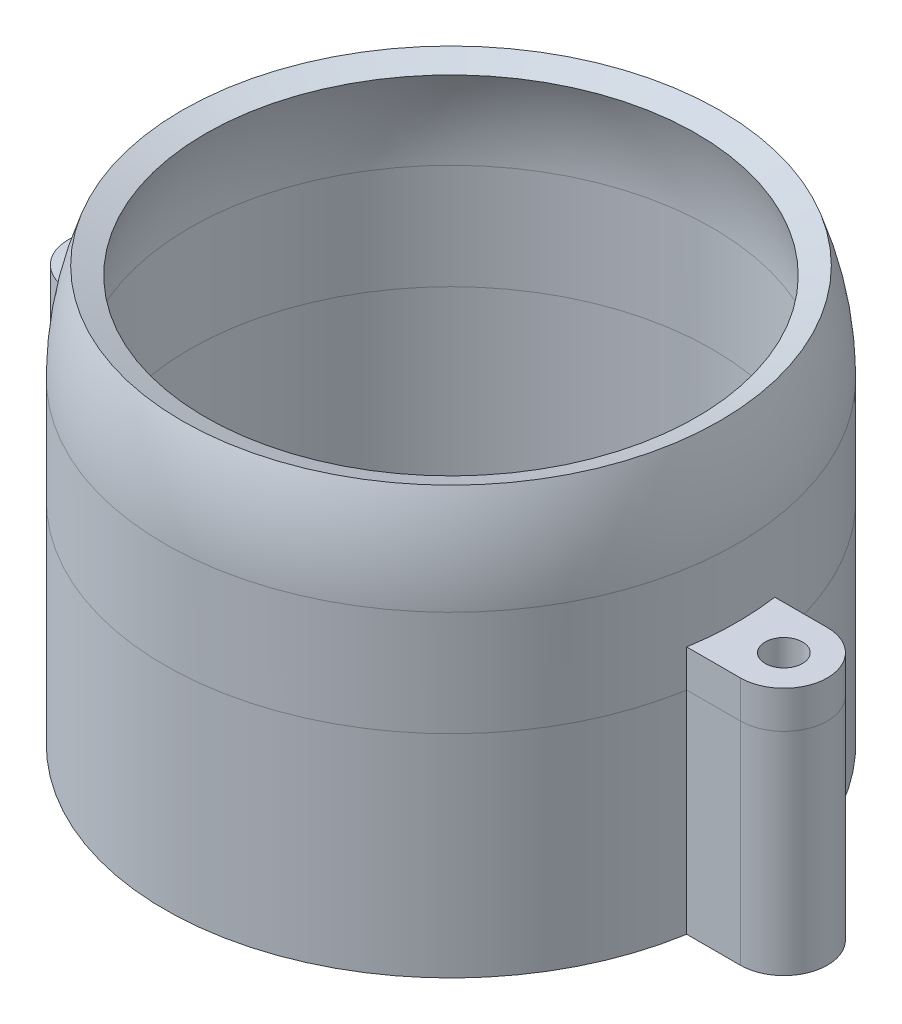
ISO-10303-21;
HEADER;
FILE_DESCRIPTION(('STEP AP214'),'2;1');
FILE_NAME('part.step','',(''),(''),'','','');
FILE_SCHEMA(('AUTOMOTIVE_DESIGN { 1 0 10303 214 1 1 1 1 }'));
ENDSEC;
DATA;
#1=APPLICATION_CONTEXT('core data for automotive mechanical design processes');
#2=APPLICATION_PROTOCOL_DEFINITION('international standard','automotive_design',2000,#1);
#3=PRODUCT_CONTEXT('',#1,'mechanical');
#4=PRODUCT('Part','Part','',(#3));
#5=PRODUCT_RELATED_PRODUCT_CATEGORY('part','',(#4));
#6=PRODUCT_DEFINITION_FORMATION('','',#4);
#7=PRODUCT_DEFINITION_CONTEXT('part definition',#1,'design');
#8=PRODUCT_DEFINITION('design','',#6,#7);
#9=PRODUCT_DEFINITION_SHAPE('','',#8);
#10=(LENGTH_UNIT() NAMED_UNIT(*) SI_UNIT(.MILLI.,.METRE.));
#11=(NAMED_UNIT(*) PLANE_ANGLE_UNIT() SI_UNIT($,.RADIAN.));
#12=(NAMED_UNIT(*) SI_UNIT($,.STERADIAN.) SOLID_ANGLE_UNIT());
#13=UNCERTAINTY_MEASURE_WITH_UNIT(LENGTH_MEASURE(1.E-05),#10,'distance_accuracy_value','');
#14=(GEOMETRIC_REPRESENTATION_CONTEXT(3) GLOBAL_UNCERTAINTY_ASSIGNED_CONTEXT((#13)) GLOBAL_UNIT_ASSIGNED_CONTEXT((#10,
#11,#12)) REPRESENTATION_CONTEXT('',''));
#15=CARTESIAN_POINT('',(0.,0.,0.));
#16=DIRECTION('',(0.,0.,1.));
#17=DIRECTION('',(1.,0.,0.));
#18=AXIS2_PLACEMENT_3D('',#15,#16,#17);
#19=CARTESIAN_POINT('',(0.,17.,0.));
#20=DIRECTION('',(0.,-1.,0.));
#21=DIRECTION('',(1.,0.,0.));
#22=AXIS2_PLACEMENT_3D('',#19,#20,#21);
#23=PLANE('',#22);
#24=CARTESIAN_POINT('',(-27.,17.,0.250000000000004));
#25=DIRECTION('',(0.,-1.,0.));
#26=DIRECTION('',(1.,0.,0.));
#27=AXIS2_PLACEMENT_3D('',#24,#25,#26);
#28=CIRCLE('',#27,1.5);
#29=CARTESIAN_POINT('',(-25.5,17.,0.250000000000004));
#30=VERTEX_POINT('',#29);
#31=EDGE_CURVE('E191',#30,#30,#28,.F.);
#32=ORIENTED_EDGE('',*,*,#31,.T.);
#33=EDGE_LOOP('',(#32));
#34=FACE_BOUND('',#33,.T.);
#35=DIRECTION('',(-1.,0.,0.));
#36=VECTOR('',#35,1.);
#37=CARTESIAN_POINT('',(-27.,17.,-3.25));
#38=LINE('',#37,#36);
#39=CARTESIAN_POINT('',(-22.7692226481274,17.,-3.24999999999999));
#40=VERTEX_POINT('',#39);
#41=CARTESIAN_POINT('',(-27.,17.,-3.25));
#42=VERTEX_POINT('',#41);
#43=EDGE_CURVE('E131',#40,#42,#38,.T.);
#44=ORIENTED_EDGE('',*,*,#43,.F.);
#45=CARTESIAN_POINT('',(0.,17.,0.));
#46=DIRECTION('',(0.,-1.,0.));
#47=DIRECTION('',(1.,0.,0.));
#48=AXIS2_PLACEMENT_3D('',#45,#46,#47);
#49=CIRCLE('',#48,23.);
#50=CARTESIAN_POINT('',(22.7692226481274,17.,-3.25));
#51=VERTEX_POINT('',#50);
#52=EDGE_CURVE('E189',#40,#51,#49,.T.);
#53=ORIENTED_EDGE('',*,*,#52,.T.);
#54=DIRECTION('',(-1.,0.,0.));
#55=VECTOR('',#54,1.);
#56=CARTESIAN_POINT('',(27.,17.,-3.25));
#57=LINE('',#56,#55);
#58=CARTESIAN_POINT('',(27.,17.,-3.25));
#59=VERTEX_POINT('',#58);
#60=EDGE_CURVE('E182',#59,#51,#57,.T.);
#61=ORIENTED_EDGE('',*,*,#60,.F.);
#62=CARTESIAN_POINT('',(27.,17.,0.250000000000004));
#63=DIRECTION('',(0.,-1.,0.));
#64=DIRECTION('',(1.,0.,0.));
#65=AXIS2_PLACEMENT_3D('',#62,#63,#64);
#66=CIRCLE('',#65,3.5);
#67=CARTESIAN_POINT('',(27.,17.,3.75));
#68=VERTEX_POINT('',#67);
#69=EDGE_CURVE('E184',#68,#59,#66,.F.);
#70=ORIENTED_EDGE('',*,*,#69,.F.);
#71=DIRECTION('',(1.,0.,0.));
#72=VECTOR('',#71,1.);
#73=CARTESIAN_POINT('',(27.,17.,3.75));
#74=LINE('',#73,#72);
#75=CARTESIAN_POINT('',(22.6922343545099,17.,3.75));
#76=VERTEX_POINT('',#75);
#77=EDGE_CURVE('E179',#76,#68,#74,.T.);
#78=ORIENTED_EDGE('',*,*,#77,.F.);
#79=CARTESIAN_POINT('',(-22.6922343545099,17.,3.75));
#80=VERTEX_POINT('',#79);
#81=EDGE_CURVE('E126',#76,#80,#49,.T.);
#82=ORIENTED_EDGE('',*,*,#81,.T.);
#83=DIRECTION('',(1.,0.,0.));
#84=VECTOR('',#83,1.);
#85=CARTESIAN_POINT('',(-27.,17.,3.75));
#86=LINE('',#85,#84);
#87=CARTESIAN_POINT('',(-27.,17.,3.75));
#88=VERTEX_POINT('',#87);
#89=EDGE_CURVE('E120',#88,#80,#86,.T.);
#90=ORIENTED_EDGE('',*,*,#89,.F.);
#91=CARTESIAN_POINT('',(-27.,17.,0.250000000000004));
#92=DIRECTION('',(0.,-1.,0.));
#93=DIRECTION('',(1.,0.,0.));
#94=AXIS2_PLACEMENT_3D('',#91,#92,#93);
#95=CIRCLE('',#94,3.5);
#96=EDGE_CURVE('E123',#42,#88,#95,.F.);
#97=ORIENTED_EDGE('',*,*,#96,.F.);
#98=EDGE_LOOP('',(#44,#53,#61,#70,#78,#82,#90,#97));
#99=FACE_BOUND('',#98,.T.);
#100=CARTESIAN_POINT('',(27.,17.,0.250000000000004));
#101=DIRECTION('',(0.,-1.,0.));
#102=DIRECTION('',(1.,0.,0.));
#103=AXIS2_PLACEMENT_3D('',#100,#101,#102);
#104=CIRCLE('',#103,1.5);
#105=CARTESIAN_POINT('',(28.5,17.,0.250000000000004));
#106=VERTEX_POINT('',#105);
#107=EDGE_CURVE('E153',#106,#106,#104,.F.);
#108=ORIENTED_EDGE('',*,*,#107,.T.);
#109=EDGE_LOOP('',(#108));
#110=FACE_BOUND('',#109,.T.);
#111=CARTESIAN_POINT('',(0.,17.,0.));
#112=DIRECTION('',(0.,-1.,0.));
#113=DIRECTION('',(1.,0.,0.));
#114=AXIS2_PLACEMENT_3D('',#111,#112,#113);
#115=CIRCLE('',#114,21.);
#116=CARTESIAN_POINT('',(21.,17.,0.));
#117=VERTEX_POINT('',#116);
#118=EDGE_CURVE('E139',#117,#117,#115,.T.);
#119=ORIENTED_EDGE('',*,*,#118,.F.);
#120=EDGE_LOOP('',(#119));
#121=FACE_BOUND('',#120,.T.);
#122=ADVANCED_FACE('F51',(#34,#99,#110,#121),#23,.T.);
#123=CARTESIAN_POINT('',(0.,25.4499443206436,0.));
#124=DIRECTION('',(0.,1.,0.));
#125=DIRECTION('',(-1.,0.,0.));
#126=AXIS2_PLACEMENT_3D('',#123,#124,#125);
#127=CYLINDRICAL_SURFACE('',#126,23.);
#128=CARTESIAN_POINT('',(0.,25.4499443206436,0.));
#129=DIRECTION('',(0.,1.,0.));
#130=DIRECTION('',(-1.,0.,0.));
#131=AXIS2_PLACEMENT_3D('',#128,#129,#130);
#132=CIRCLE('',#131,23.);
#133=CARTESIAN_POINT('',(-23.,25.4499443206436,0.));
#134=VERTEX_POINT('',#133);
#135=EDGE_CURVE('E181',#134,#134,#132,.T.);
#136=ORIENTED_EDGE('',*,*,#135,.F.);
#137=EDGE_LOOP('',(#136));
#138=FACE_BOUND('',#137,.T.);
#139=ORIENTED_EDGE('',*,*,#81,.F.);
#140=DIRECTION('',(0.,-1.,0.));
#141=VECTOR('',#140,1.);
#142=CARTESIAN_POINT('',(22.6922343545099,20.,3.75));
#143=LINE('',#142,#141);
#144=CARTESIAN_POINT('',(22.6922343545099,20.,3.75));
#145=VERTEX_POINT('',#144);
#146=EDGE_CURVE('E163',#145,#76,#143,.T.);
#147=ORIENTED_EDGE('',*,*,#146,.F.);
#148=CARTESIAN_POINT('',(0.,20.,0.));
#149=DIRECTION('',(0.,1.,0.));
#150=DIRECTION('',(0.,0.,-1.));
#151=AXIS2_PLACEMENT_3D('',#148,#149,#150);
#152=CIRCLE('',#151,23.);
#153=CARTESIAN_POINT('',(22.7692226481274,20.,-3.25));
#154=VERTEX_POINT('',#153);
#155=EDGE_CURVE('E167',#145,#154,#152,.T.);
#156=ORIENTED_EDGE('',*,*,#155,.T.);
#157=DIRECTION('',(0.,-1.,0.));
#158=VECTOR('',#157,1.);
#159=CARTESIAN_POINT('',(22.7692226481274,20.,-3.25));
#160=LINE('',#159,#158);
#161=EDGE_CURVE('E160',#154,#51,#160,.T.);
#162=ORIENTED_EDGE('',*,*,#161,.T.);
#163=ORIENTED_EDGE('',*,*,#52,.F.);
#164=DIRECTION('',(0.,-1.,0.));
#165=VECTOR('',#164,1.);
#166=CARTESIAN_POINT('',(-22.7692226481274,20.,-3.24999999999999));
#167=LINE('',#166,#165);
#168=CARTESIAN_POINT('',(-22.7692226481274,20.,-3.24999999999999));
#169=VERTEX_POINT('',#168);
#170=EDGE_CURVE('E147',#169,#40,#167,.T.);
#171=ORIENTED_EDGE('',*,*,#170,.F.);
#172=CARTESIAN_POINT('',(0.,20.,0.));
#173=DIRECTION('',(0.,1.,0.));
#174=DIRECTION('',(0.,0.,1.));
#175=AXIS2_PLACEMENT_3D('',#172,#173,#174);
#176=CIRCLE('',#175,23.);
#177=CARTESIAN_POINT('',(-22.6922343545099,20.,3.75));
#178=VERTEX_POINT('',#177);
#179=EDGE_CURVE('E254',#169,#178,#176,.T.);
#180=ORIENTED_EDGE('',*,*,#179,.T.);
#181=DIRECTION('',(0.,-1.,0.));
#182=VECTOR('',#181,1.);
#183=CARTESIAN_POINT('',(-22.6922343545099,20.,3.75));
#184=LINE('',#183,#182);
#185=EDGE_CURVE('E144',#178,#80,#184,.T.);
#186=ORIENTED_EDGE('',*,*,#185,.T.);
#187=EDGE_LOOP('',(#139,#147,#156,#162,#163,#171,#180,#186));
#188=FACE_BOUND('',#187,.T.);
#189=ADVANCED_FACE('F216',(#138,#188),#127,.T.);
#190=CARTESIAN_POINT('',(0.,25.4499443206436,0.));
#191=DIRECTION('',(0.,1.,0.));
#192=DIRECTION('',(-1.,0.,0.));
#193=AXIS2_PLACEMENT_3D('',#190,#191,#192);
#194=CYLINDRICAL_SURFACE('',#193,21.);
#195=CARTESIAN_POINT('',(0.,25.4499443206436,0.));
#196=DIRECTION('',(0.,1.,0.));
#197=DIRECTION('',(-1.,0.,0.));
#198=AXIS2_PLACEMENT_3D('',#195,#196,#197);
#199=CIRCLE('',#198,21.);
#200=CARTESIAN_POINT('',(-21.,25.4499443206436,0.));
#201=VERTEX_POINT('',#200);
#202=EDGE_CURVE('E261',#201,#201,#199,.T.);
#203=ORIENTED_EDGE('',*,*,#202,.T.);
#204=EDGE_LOOP('',(#203));
#205=FACE_BOUND('',#204,.T.);
#206=ORIENTED_EDGE('',*,*,#118,.T.);
#207=EDGE_LOOP('',(#206));
#208=FACE_BOUND('',#207,.T.);
#209=ADVANCED_FACE('F218',(#205,#208),#194,.F.);
#210=CARTESIAN_POINT('',(-27.,20.,0.250000000000004));
#211=DIRECTION('',(0.,-1.,0.));
#212=DIRECTION('',(0.,0.,-1.));
#213=AXIS2_PLACEMENT_3D('',#210,#211,#212);
#214=CYLINDRICAL_SURFACE('',#213,3.5);
#215=DIRECTION('',(0.,-1.,0.));
#216=VECTOR('',#215,1.);
#217=CARTESIAN_POINT('',(-27.,20.,-3.25));
#218=LINE('',#217,#216);
#219=CARTESIAN_POINT('',(-27.,20.,-3.25));
#220=VERTEX_POINT('',#219);
#221=EDGE_CURVE('E138',#220,#42,#218,.T.);
#222=ORIENTED_EDGE('',*,*,#221,.T.);
#223=ORIENTED_EDGE('',*,*,#96,.T.);
#224=DIRECTION('',(0.,-1.,0.));
#225=VECTOR('',#224,1.);
#226=CARTESIAN_POINT('',(-27.,20.,3.75));
#227=LINE('',#226,#225);
#228=CARTESIAN_POINT('',(-27.,20.,3.75));
#229=VERTEX_POINT('',#228);
#230=EDGE_CURVE('E136',#229,#88,#227,.T.);
#231=ORIENTED_EDGE('',*,*,#230,.F.);
#232=CARTESIAN_POINT('',(-27.,20.,0.250000000000004));
#233=DIRECTION('',(0.,-1.,0.));
#234=DIRECTION('',(0.,0.,-1.));
#235=AXIS2_PLACEMENT_3D('',#232,#233,#234);
#236=CIRCLE('',#235,3.5);
#237=EDGE_CURVE('E251',#229,#220,#236,.T.);
#238=ORIENTED_EDGE('',*,*,#237,.T.);
#239=EDGE_LOOP('',(#222,#223,#231,#238));
#240=FACE_BOUND('',#239,.T.);
#241=ADVANCED_FACE('F134',(#240),#214,.T.);
#242=CARTESIAN_POINT('',(-27.,20.,3.75));
#243=DIRECTION('',(0.,0.,1.));
#244=DIRECTION('',(1.,0.,0.));
#245=AXIS2_PLACEMENT_3D('',#242,#243,#244);
#246=PLANE('',#245);
#247=ORIENTED_EDGE('',*,*,#230,.T.);
#248=ORIENTED_EDGE('',*,*,#89,.T.);
#249=ORIENTED_EDGE('',*,*,#185,.F.);
#250=DIRECTION('',(-1.,0.,0.));
#251=VECTOR('',#250,1.);
#252=CARTESIAN_POINT('',(-27.,20.,3.75));
#253=LINE('',#252,#251);
#254=EDGE_CURVE('E143',#178,#229,#253,.T.);
#255=ORIENTED_EDGE('',*,*,#254,.T.);
#256=EDGE_LOOP('',(#247,#248,#249,#255));
#257=FACE_BOUND('',#256,.T.);
#258=ADVANCED_FACE('F53',(#257),#246,.T.);
#259=CARTESIAN_POINT('',(-27.,20.,-3.25));
#260=DIRECTION('',(0.,0.,-1.));
#261=DIRECTION('',(-1.,0.,0.));
#262=AXIS2_PLACEMENT_3D('',#259,#260,#261);
#263=PLANE('',#262);
#264=ORIENTED_EDGE('',*,*,#170,.T.);
#265=ORIENTED_EDGE('',*,*,#43,.T.);
#266=ORIENTED_EDGE('',*,*,#221,.F.);
#267=DIRECTION('',(1.,0.,0.));
#268=VECTOR('',#267,1.);
#269=CARTESIAN_POINT('',(-27.,20.,-3.25));
#270=LINE('',#269,#268);
#271=EDGE_CURVE('E252',#220,#169,#270,.T.);
#272=ORIENTED_EDGE('',*,*,#271,.T.);
#273=EDGE_LOOP('',(#264,#265,#266,#272));
#274=FACE_BOUND('',#273,.T.);
#275=ADVANCED_FACE('F240',(#274),#263,.T.);
#276=CARTESIAN_POINT('',(-27.,20.,0.250000000000004));
#277=DIRECTION('',(0.,-1.,0.));
#278=DIRECTION('',(0.,0.,-1.));
#279=AXIS2_PLACEMENT_3D('',#276,#277,#278);
#280=CYLINDRICAL_SURFACE('',#279,1.5);
#281=CARTESIAN_POINT('',(-27.,20.,0.250000000000004));
#282=DIRECTION('',(0.,-1.,0.));
#283=DIRECTION('',(0.,0.,-1.));
#284=AXIS2_PLACEMENT_3D('',#281,#282,#283);
#285=CIRCLE('',#284,1.5);
#286=CARTESIAN_POINT('',(-27.,20.,-1.25));
#287=VERTEX_POINT('',#286);
#288=EDGE_CURVE('E161',#287,#287,#285,.T.);
#289=ORIENTED_EDGE('',*,*,#288,.F.);
#290=EDGE_LOOP('',(#289));
#291=FACE_BOUND('',#290,.T.);
#292=ORIENTED_EDGE('',*,*,#31,.F.);
#293=EDGE_LOOP('',(#292));
#294=FACE_BOUND('',#293,.T.);
#295=ADVANCED_FACE('F234',(#291,#294),#280,.F.);
#296=CARTESIAN_POINT('',(27.,20.,0.250000000000004));
#297=DIRECTION('',(0.,-1.,0.));
#298=DIRECTION('',(0.,0.,-1.));
#299=AXIS2_PLACEMENT_3D('',#296,#297,#298);
#300=CYLINDRICAL_SURFACE('',#299,3.5);
#301=DIRECTION('',(0.,-1.,0.));
#302=VECTOR('',#301,1.);
#303=CARTESIAN_POINT('',(27.,20.,3.75));
#304=LINE('',#303,#302);
#305=CARTESIAN_POINT('',(27.,20.,3.75));
#306=VERTEX_POINT('',#305);
#307=EDGE_CURVE('E55',#306,#68,#304,.T.);
#308=ORIENTED_EDGE('',*,*,#307,.T.);
#309=ORIENTED_EDGE('',*,*,#69,.T.);
#310=DIRECTION('',(0.,-1.,0.));
#311=VECTOR('',#310,1.);
#312=CARTESIAN_POINT('',(27.,20.,-3.25));
#313=LINE('',#312,#311);
#314=CARTESIAN_POINT('',(27.,20.,-3.25));
#315=VERTEX_POINT('',#314);
#316=EDGE_CURVE('E75',#315,#59,#313,.T.);
#317=ORIENTED_EDGE('',*,*,#316,.F.);
#318=CARTESIAN_POINT('',(27.,20.,0.250000000000004));
#319=DIRECTION('',(0.,-1.,0.));
#320=DIRECTION('',(0.,0.,1.));
#321=AXIS2_PLACEMENT_3D('',#318,#319,#320);
#322=CIRCLE('',#321,3.5);
#323=EDGE_CURVE('E60',#315,#306,#322,.T.);
#324=ORIENTED_EDGE('',*,*,#323,.T.);
#325=EDGE_LOOP('',(#308,#309,#317,#324));
#326=FACE_BOUND('',#325,.T.);
#327=ADVANCED_FACE('F232',(#326),#300,.T.);
#328=CARTESIAN_POINT('',(27.,20.,-3.25));
#329=DIRECTION('',(0.,0.,-1.));
#330=DIRECTION('',(-1.,0.,0.));
#331=AXIS2_PLACEMENT_3D('',#328,#329,#330);
#332=PLANE('',#331);
#333=ORIENTED_EDGE('',*,*,#316,.T.);
#334=ORIENTED_EDGE('',*,*,#60,.T.);
#335=ORIENTED_EDGE('',*,*,#161,.F.);
#336=DIRECTION('',(1.,0.,0.));
#337=VECTOR('',#336,1.);
#338=CARTESIAN_POINT('',(27.,20.,-3.25));
#339=LINE('',#338,#337);
#340=EDGE_CURVE('E165',#154,#315,#339,.T.);
#341=ORIENTED_EDGE('',*,*,#340,.T.);
#342=EDGE_LOOP('',(#333,#334,#335,#341));
#343=FACE_BOUND('',#342,.T.);
#344=ADVANCED_FACE('F212',(#343),#332,.T.);
#345=CARTESIAN_POINT('',(27.,20.,3.75));
#346=DIRECTION('',(0.,0.,1.));
#347=DIRECTION('',(1.,0.,0.));
#348=AXIS2_PLACEMENT_3D('',#345,#346,#347);
#349=PLANE('',#348);
#350=ORIENTED_EDGE('',*,*,#146,.T.);
#351=ORIENTED_EDGE('',*,*,#77,.T.);
#352=ORIENTED_EDGE('',*,*,#307,.F.);
#353=DIRECTION('',(-1.,0.,0.));
#354=VECTOR('',#353,1.);
#355=CARTESIAN_POINT('',(27.,20.,3.75));
#356=LINE('',#355,#354);
#357=EDGE_CURVE('E172',#306,#145,#356,.T.);
#358=ORIENTED_EDGE('',*,*,#357,.T.);
#359=EDGE_LOOP('',(#350,#351,#352,#358));
#360=FACE_BOUND('',#359,.T.);
#361=ADVANCED_FACE('F202',(#360),#349,.T.);
#362=CARTESIAN_POINT('',(27.,20.,0.250000000000004));
#363=DIRECTION('',(0.,-1.,0.));
#364=DIRECTION('',(0.,0.,-1.));
#365=AXIS2_PLACEMENT_3D('',#362,#363,#364);
#366=CYLINDRICAL_SURFACE('',#365,1.5);
#367=CARTESIAN_POINT('',(27.,20.,0.250000000000004));
#368=DIRECTION('',(0.,-1.,0.));
#369=DIRECTION('',(0.,0.,1.));
#370=AXIS2_PLACEMENT_3D('',#367,#368,#369);
#371=CIRCLE('',#370,1.5);
#372=CARTESIAN_POINT('',(27.,20.,1.75));
#373=VERTEX_POINT('',#372);
#374=EDGE_CURVE('E12',#373,#373,#371,.T.);
#375=ORIENTED_EDGE('',*,*,#374,.F.);
#376=EDGE_LOOP('',(#375));
#377=FACE_BOUND('',#376,.T.);
#378=ORIENTED_EDGE('',*,*,#107,.F.);
#379=EDGE_LOOP('',(#378));
#380=FACE_BOUND('',#379,.T.);
#381=ADVANCED_FACE('F199',(#377,#380),#366,.F.);
#382=CARTESIAN_POINT('',(0.,25.4499443206436,0.));
#383=DIRECTION('',(0.,1.,0.));
#384=DIRECTION('',(-1.,0.,0.));
#385=AXIS2_PLACEMENT_3D('',#382,#383,#384);
#386=SPHERICAL_SURFACE('',#385,23.);
#387=CARTESIAN_POINT('',(0.,33.316407617134,0.));
#388=DIRECTION('',(0.,1.,0.));
#389=DIRECTION('',(-1.,0.,0.));
#390=AXIS2_PLACEMENT_3D('',#387,#388,#389);
#391=CIRCLE('',#390,21.6129302780759);
#392=CARTESIAN_POINT('',(-21.6129302780759,33.316407617134,0.));
#393=VERTEX_POINT('',#392);
#394=EDGE_CURVE('E145',#393,#393,#391,.T.);
#395=ORIENTED_EDGE('',*,*,#394,.F.);
#396=EDGE_LOOP('',(#395));
#397=FACE_BOUND('',#396,.T.);
#398=ORIENTED_EDGE('',*,*,#135,.T.);
#399=EDGE_LOOP('',(#398));
#400=FACE_BOUND('',#399,.T.);
#401=ADVANCED_FACE('F201',(#397,#400),#386,.T.);
#402=CARTESIAN_POINT('',(0.,25.4499443206436,0.));
#403=DIRECTION('',(0.,1.,0.));
#404=DIRECTION('',(-1.,0.,0.));
#405=AXIS2_PLACEMENT_3D('',#402,#403,#404);
#406=SPHERICAL_SURFACE('',#405,21.);
#407=CARTESIAN_POINT('',(0.,32.6323673304827,0.));
#408=DIRECTION('',(0.,1.,0.));
#409=DIRECTION('',(-1.,0.,0.));
#410=AXIS2_PLACEMENT_3D('',#407,#408,#409);
#411=CIRCLE('',#410,19.7335450365041);
#412=CARTESIAN_POINT('',(-19.7335450365041,32.6323673304827,0.));
#413=VERTEX_POINT('',#412);
#414=EDGE_CURVE('E150',#413,#413,#411,.T.);
#415=ORIENTED_EDGE('',*,*,#414,.T.);
#416=EDGE_LOOP('',(#415));
#417=FACE_BOUND('',#416,.T.);
#418=ORIENTED_EDGE('',*,*,#202,.F.);
#419=EDGE_LOOP('',(#418));
#420=FACE_BOUND('',#419,.T.);
#421=ADVANCED_FACE('F209',(#417,#420),#406,.F.);
#422=CARTESIAN_POINT('',(0.,32.6323673304827,0.));
#423=DIRECTION('',(0.,1.,0.));
#424=DIRECTION('',(-1.,0.,0.));
#425=AXIS2_PLACEMENT_3D('',#422,#423,#424);
#426=CONICAL_SURFACE('',#425,19.7335450365041,1.22173047639603);
#427=ORIENTED_EDGE('',*,*,#394,.T.);
#428=EDGE_LOOP('',(#427));
#429=FACE_BOUND('',#428,.T.);
#430=ORIENTED_EDGE('',*,*,#414,.F.);
#431=EDGE_LOOP('',(#430));
#432=FACE_BOUND('',#431,.T.);
#433=ADVANCED_FACE('F270',(#429,#432),#426,.F.);
#434=CARTESIAN_POINT('',(-27.,20.,0.250000000000004));
#435=DIRECTION('',(0.,-1.,0.));
#436=DIRECTION('',(0.,0.,-1.));
#437=AXIS2_PLACEMENT_3D('',#434,#435,#436);
#438=PLANE('',#437);
#439=ORIENTED_EDGE('',*,*,#288,.T.);
#440=EDGE_LOOP('',(#439));
#441=FACE_BOUND('',#440,.T.);
#442=ORIENTED_EDGE('',*,*,#237,.F.);
#443=ORIENTED_EDGE('',*,*,#254,.F.);
#444=ORIENTED_EDGE('',*,*,#179,.F.);
#445=ORIENTED_EDGE('',*,*,#271,.F.);
#446=EDGE_LOOP('',(#442,#443,#444,#445));
#447=FACE_BOUND('',#446,.T.);
#448=ADVANCED_FACE('F276',(#441,#447),#438,.F.);
#449=CARTESIAN_POINT('',(27.,20.,0.250000000000004));
#450=DIRECTION('',(0.,1.,0.));
#451=DIRECTION('',(0.,0.,1.));
#452=AXIS2_PLACEMENT_3D('',#449,#450,#451);
#453=PLANE('',#452);
#454=ORIENTED_EDGE('',*,*,#374,.T.);
#455=EDGE_LOOP('',(#454));
#456=FACE_BOUND('',#455,.T.);
#457=ORIENTED_EDGE('',*,*,#323,.F.);
#458=ORIENTED_EDGE('',*,*,#340,.F.);
#459=ORIENTED_EDGE('',*,*,#155,.F.);
#460=ORIENTED_EDGE('',*,*,#357,.F.);
#461=EDGE_LOOP('',(#457,#458,#459,#460));
#462=FACE_BOUND('',#461,.T.);
#463=ADVANCED_FACE('F228',(#456,#462),#453,.T.);
#464=CLOSED_SHELL('',(#122,#189,#209,#241,#258,#275,#295,#327,#344,#361,#381,#401,#421,#433,
#448,#463));
#465=MANIFOLD_SOLID_BREP('B2',#464);
#466=CARTESIAN_POINT('',(0.,17.,0.));
#467=DIRECTION('',(0.,-1.,0.));
#468=DIRECTION('',(1.,0.,0.));
#469=AXIS2_PLACEMENT_3D('',#466,#467,#468);
#470=PLANE('',#469);
#471=CARTESIAN_POINT('',(0.,17.,0.));
#472=DIRECTION('',(0.,-1.,0.));
#473=DIRECTION('',(1.,0.,0.));
#474=AXIS2_PLACEMENT_3D('',#471,#472,#473);
#475=CIRCLE('',#474,21.);
#476=CARTESIAN_POINT('',(21.,17.,0.));
#477=VERTEX_POINT('',#476);
#478=EDGE_CURVE('E395',#477,#477,#475,.T.);
#479=ORIENTED_EDGE('',*,*,#478,.T.);
#480=EDGE_LOOP('',(#479));
#481=FACE_BOUND('',#480,.T.);
#482=CARTESIAN_POINT('',(27.,17.,0.250000000000004));
#483=DIRECTION('',(0.,-1.,0.));
#484=DIRECTION('',(1.,0.,0.));
#485=AXIS2_PLACEMENT_3D('',#482,#483,#484);
#486=CIRCLE('',#485,1.5);
#487=CARTESIAN_POINT('',(28.5,17.,0.250000000000004));
#488=VERTEX_POINT('',#487);
#489=EDGE_CURVE('E542',#488,#488,#486,.F.);
#490=ORIENTED_EDGE('',*,*,#489,.F.);
#491=EDGE_LOOP('',(#490));
#492=FACE_BOUND('',#491,.T.);
#493=DIRECTION('',(-1.,0.,0.));
#494=VECTOR('',#493,1.);
#495=CARTESIAN_POINT('',(-27.,17.,-3.25));
#496=LINE('',#495,#494);
#497=CARTESIAN_POINT('',(-22.7692226481274,17.,-3.24999999999999));
#498=VERTEX_POINT('',#497);
#499=CARTESIAN_POINT('',(-27.,17.,-3.25));
#500=VERTEX_POINT('',#499);
#501=EDGE_CURVE('E565',#498,#500,#496,.T.);
#502=ORIENTED_EDGE('',*,*,#501,.T.);
#503=CARTESIAN_POINT('',(-27.,17.,0.250000000000004));
#504=DIRECTION('',(0.,-1.,0.));
#505=DIRECTION('',(1.,0.,0.));
#506=AXIS2_PLACEMENT_3D('',#503,#504,#505);
#507=CIRCLE('',#506,3.5);
#508=CARTESIAN_POINT('',(-27.,17.,3.75));
#509=VERTEX_POINT('',#508);
#510=EDGE_CURVE('E577',#500,#509,#507,.F.);
#511=ORIENTED_EDGE('',*,*,#510,.T.);
#512=DIRECTION('',(1.,0.,0.));
#513=VECTOR('',#512,1.);
#514=CARTESIAN_POINT('',(-27.,17.,3.75));
#515=LINE('',#514,#513);
#516=CARTESIAN_POINT('',(-22.6922343545099,17.,3.75));
#517=VERTEX_POINT('',#516);
#518=EDGE_CURVE('E573',#509,#517,#515,.T.);
#519=ORIENTED_EDGE('',*,*,#518,.T.);
#520=CARTESIAN_POINT('',(0.,17.,0.));
#521=DIRECTION('',(0.,-1.,0.));
#522=DIRECTION('',(1.,0.,0.));
#523=AXIS2_PLACEMENT_3D('',#520,#521,#522);
#524=CIRCLE('',#523,23.);
#525=CARTESIAN_POINT('',(22.6922343545099,17.,3.75));
#526=VERTEX_POINT('',#525);
#527=EDGE_CURVE('E566',#526,#517,#524,.T.);
#528=ORIENTED_EDGE('',*,*,#527,.F.);
#529=DIRECTION('',(1.,0.,0.));
#530=VECTOR('',#529,1.);
#531=CARTESIAN_POINT('',(27.,17.,3.75));
#532=LINE('',#531,#530);
#533=CARTESIAN_POINT('',(27.,17.,3.75));
#534=VERTEX_POINT('',#533);
#535=EDGE_CURVE('E49',#526,#534,#532,.T.);
#536=ORIENTED_EDGE('',*,*,#535,.T.);
#537=CARTESIAN_POINT('',(27.,17.,0.250000000000004));
#538=DIRECTION('',(0.,-1.,0.));
#539=DIRECTION('',(1.,0.,0.));
#540=AXIS2_PLACEMENT_3D('',#537,#538,#539);
#541=CIRCLE('',#540,3.5);
#542=CARTESIAN_POINT('',(27.,17.,-3.25));
#543=VERTEX_POINT('',#542);
#544=EDGE_CURVE('E409',#534,#543,#541,.F.);
#545=ORIENTED_EDGE('',*,*,#544,.T.);
#546=DIRECTION('',(-1.,0.,0.));
#547=VECTOR('',#546,1.);
#548=CARTESIAN_POINT('',(27.,17.,-3.25));
#549=LINE('',#548,#547);
#550=CARTESIAN_POINT('',(22.7692226481274,17.,-3.25));
#551=VERTEX_POINT('',#550);
#552=EDGE_CURVE('E401',#543,#551,#549,.T.);
#553=ORIENTED_EDGE('',*,*,#552,.T.);
#554=EDGE_CURVE('E569',#498,#551,#524,.T.);
#555=ORIENTED_EDGE('',*,*,#554,.F.);
#556=EDGE_LOOP('',(#502,#511,#519,#528,#536,#545,#553,#555));
#557=FACE_BOUND('',#556,.T.);
#558=CARTESIAN_POINT('',(-27.,17.,0.250000000000004));
#559=DIRECTION('',(0.,-1.,0.));
#560=DIRECTION('',(1.,0.,0.));
#561=AXIS2_PLACEMENT_3D('',#558,#559,#560);
#562=CIRCLE('',#561,1.5);
#563=CARTESIAN_POINT('',(-25.5,17.,0.250000000000004));
#564=VERTEX_POINT('',#563);
#565=EDGE_CURVE('E561',#564,#564,#562,.F.);
#566=ORIENTED_EDGE('',*,*,#565,.F.);
#567=EDGE_LOOP('',(#566));
#568=FACE_BOUND('',#567,.T.);
#569=ADVANCED_FACE('F392',(#481,#492,#557,#568),#470,.F.);
#570=CARTESIAN_POINT('',(0.,4.,0.));
#571=DIRECTION('',(0.,-1.,0.));
#572=DIRECTION('',(1.,0.,0.));
#573=AXIS2_PLACEMENT_3D('',#570,#571,#572);
#574=PLANE('',#573);
#575=CARTESIAN_POINT('',(2.49999999999996,4.,4.33012701892222));
#576=DIRECTION('',(0.,-1.,0.));
#577=DIRECTION('',(1.,0.,0.));
#578=AXIS2_PLACEMENT_3D('',#575,#576,#577);
#579=CIRCLE('',#578,2.96647939483827);
#580=CARTESIAN_POINT('',(5.46647939483823,4.,4.33012701892222));
#581=VERTEX_POINT('',#580);
#582=EDGE_CURVE('E553',#581,#581,#579,.F.);
#583=ORIENTED_EDGE('',*,*,#582,.F.);
#584=EDGE_LOOP('',(#583));
#585=FACE_BOUND('',#584,.T.);
#586=CARTESIAN_POINT('',(2.50000000000002,4.,-4.33012701892218));
#587=DIRECTION('',(0.,-1.,0.));
#588=DIRECTION('',(1.,0.,0.));
#589=AXIS2_PLACEMENT_3D('',#586,#587,#588);
#590=CIRCLE('',#589,2.96647939483827);
#591=CARTESIAN_POINT('',(5.46647939483829,4.,-4.33012701892218));
#592=VERTEX_POINT('',#591);
#593=EDGE_CURVE('E547',#592,#592,#590,.F.);
#594=ORIENTED_EDGE('',*,*,#593,.F.);
#595=EDGE_LOOP('',(#594));
#596=FACE_BOUND('',#595,.T.);
#597=CARTESIAN_POINT('',(-5.,4.,0.));
#598=DIRECTION('',(0.,-1.,0.));
#599=DIRECTION('',(1.,0.,0.));
#600=AXIS2_PLACEMENT_3D('',#597,#598,#599);
#601=CIRCLE('',#600,2.96647939483827);
#602=CARTESIAN_POINT('',(-2.03352060516173,4.,0.));
#603=VERTEX_POINT('',#602);
#604=EDGE_CURVE('E484',#603,#603,#601,.F.);
#605=ORIENTED_EDGE('',*,*,#604,.F.);
#606=EDGE_LOOP('',(#605));
#607=FACE_BOUND('',#606,.T.);
#608=CARTESIAN_POINT('',(0.,4.,0.));
#609=DIRECTION('',(0.,1.,0.));
#610=DIRECTION('',(-1.,0.,0.));
#611=AXIS2_PLACEMENT_3D('',#608,#609,#610);
#612=CIRCLE('',#611,9.15767728552784);
#613=CARTESIAN_POINT('',(-9.15767728552784,4.,0.));
#614=VERTEX_POINT('',#613);
#615=EDGE_CURVE('E534',#614,#614,#612,.T.);
#616=ORIENTED_EDGE('',*,*,#615,.T.);
#617=EDGE_LOOP('',(#616));
#618=FACE_BOUND('',#617,.T.);
#619=ADVANCED_FACE('F611',(#585,#596,#607,#618),#574,.F.);
#620=CARTESIAN_POINT('',(0.,25.4499443206436,0.));
#621=DIRECTION('',(0.,1.,0.));
#622=DIRECTION('',(-1.,0.,0.));
#623=AXIS2_PLACEMENT_3D('',#620,#621,#622);
#624=CYLINDRICAL_SURFACE('',#623,9.15767728552784);
#625=CARTESIAN_POINT('',(0.,2.,0.));
#626=DIRECTION('',(0.,1.,0.));
#627=DIRECTION('',(-1.,0.,0.));
#628=AXIS2_PLACEMENT_3D('',#625,#626,#627);
#629=CIRCLE('',#628,9.15767728552784);
#630=CARTESIAN_POINT('',(-9.15767728552784,2.,0.));
#631=VERTEX_POINT('',#630);
#632=EDGE_CURVE('E530',#631,#631,#629,.T.);
#633=ORIENTED_EDGE('',*,*,#632,.T.);
#634=EDGE_LOOP('',(#633));
#635=FACE_BOUND('',#634,.T.);
#636=ORIENTED_EDGE('',*,*,#615,.F.);
#637=EDGE_LOOP('',(#636));
#638=FACE_BOUND('',#637,.T.);
#639=ADVANCED_FACE('F617',(#635,#638),#624,.T.);
#640=CARTESIAN_POINT('',(0.,2.,0.));
#641=DIRECTION('',(0.,1.,0.));
#642=DIRECTION('',(-1.,0.,0.));
#643=AXIS2_PLACEMENT_3D('',#640,#641,#642);
#644=PLANE('',#643);
#645=CARTESIAN_POINT('',(0.,2.,0.));
#646=DIRECTION('',(0.,1.,0.));
#647=DIRECTION('',(-1.,0.,0.));
#648=AXIS2_PLACEMENT_3D('',#645,#646,#647);
#649=CIRCLE('',#648,21.);
#650=CARTESIAN_POINT('',(-21.,2.,0.));
#651=VERTEX_POINT('',#650);
#652=EDGE_CURVE('E518',#651,#651,#649,.T.);
#653=ORIENTED_EDGE('',*,*,#652,.T.);
#654=EDGE_LOOP('',(#653));
#655=FACE_BOUND('',#654,.T.);
#656=ORIENTED_EDGE('',*,*,#632,.F.);
#657=EDGE_LOOP('',(#656));
#658=FACE_BOUND('',#657,.T.);
#659=ADVANCED_FACE('F641',(#655,#658),#644,.T.);
#660=CARTESIAN_POINT('',(0.,25.4499443206436,0.));
#661=DIRECTION('',(0.,1.,0.));
#662=DIRECTION('',(-1.,0.,0.));
#663=AXIS2_PLACEMENT_3D('',#660,#661,#662);
#664=CYLINDRICAL_SURFACE('',#663,21.);
#665=ORIENTED_EDGE('',*,*,#478,.F.);
#666=EDGE_LOOP('',(#665));
#667=FACE_BOUND('',#666,.T.);
#668=ORIENTED_EDGE('',*,*,#652,.F.);
#669=EDGE_LOOP('',(#668));
#670=FACE_BOUND('',#669,.T.);
#671=ADVANCED_FACE('F637',(#667,#670),#664,.F.);
#672=CARTESIAN_POINT('',(-5.,3.1,0.));
#673=DIRECTION('',(0.,1.,0.));
#674=DIRECTION('',(-1.,0.,0.));
#675=AXIS2_PLACEMENT_3D('',#672,#673,#674);
#676=SPHERICAL_SURFACE('',#675,3.1);
#677=CARTESIAN_POINT('',(-5.,3.1,0.));
#678=DIRECTION('',(0.,1.,0.));
#679=DIRECTION('',(0.,0.,1.));
#680=AXIS2_PLACEMENT_3D('',#677,#678,#679);
#681=CIRCLE('',#680,3.1);
#682=CARTESIAN_POINT('',(-5.,3.1,3.1));
#683=VERTEX_POINT('',#682);
#684=EDGE_CURVE('E551',#683,#683,#681,.T.);
#685=ORIENTED_EDGE('',*,*,#684,.F.);
#686=EDGE_LOOP('',(#685));
#687=FACE_BOUND('',#686,.T.);
#688=ORIENTED_EDGE('',*,*,#604,.T.);
#689=EDGE_LOOP('',(#688));
#690=FACE_BOUND('',#689,.T.);
#691=ADVANCED_FACE('F640',(#687,#690),#676,.F.);
#692=CARTESIAN_POINT('',(2.50000000000002,3.1,-4.33012701892218));
#693=DIRECTION('',(0.,1.,0.));
#694=DIRECTION('',(0.500000000000004,0.,-0.866025403784436));
#695=AXIS2_PLACEMENT_3D('',#692,#693,#694);
#696=SPHERICAL_SURFACE('',#695,3.1);
#697=CARTESIAN_POINT('',(2.50000000000002,3.1,-4.33012701892218));
#698=DIRECTION('',(0.,1.,0.));
#699=DIRECTION('',(-0.866025403784436,0.,-0.500000000000004));
#700=AXIS2_PLACEMENT_3D('',#697,#698,#699);
#701=CIRCLE('',#700,3.1);
#702=CARTESIAN_POINT('',(-0.184678751731733,3.1,-5.8801270189222));
#703=VERTEX_POINT('',#702);
#704=EDGE_CURVE('E557',#703,#703,#701,.T.);
#705=ORIENTED_EDGE('',*,*,#704,.F.);
#706=EDGE_LOOP('',(#705));
#707=FACE_BOUND('',#706,.T.);
#708=ORIENTED_EDGE('',*,*,#593,.T.);
#709=EDGE_LOOP('',(#708));
#710=FACE_BOUND('',#709,.T.);
#711=ADVANCED_FACE('F675',(#707,#710),#696,.F.);
#712=CARTESIAN_POINT('',(2.49999999999996,3.1,4.33012701892222));
#713=DIRECTION('',(0.,1.,0.));
#714=DIRECTION('',(0.499999999999992,0.,0.866025403784443));
#715=AXIS2_PLACEMENT_3D('',#712,#713,#714);
#716=SPHERICAL_SURFACE('',#715,3.1);
#717=CARTESIAN_POINT('',(2.49999999999996,3.1,4.33012701892222));
#718=DIRECTION('',(0.,1.,0.));
#719=DIRECTION('',(0.866025403784443,0.,-0.499999999999992));
#720=AXIS2_PLACEMENT_3D('',#717,#718,#719);
#721=CIRCLE('',#720,3.1);
#722=CARTESIAN_POINT('',(5.18467875173173,3.1,2.78012701892224));
#723=VERTEX_POINT('',#722);
#724=EDGE_CURVE('E699',#723,#723,#721,.T.);
#725=ORIENTED_EDGE('',*,*,#724,.F.);
#726=EDGE_LOOP('',(#725));
#727=FACE_BOUND('',#726,.T.);
#728=ORIENTED_EDGE('',*,*,#582,.T.);
#729=EDGE_LOOP('',(#728));
#730=FACE_BOUND('',#729,.T.);
#731=ADVANCED_FACE('F681',(#727,#730),#716,.F.);
#732=CARTESIAN_POINT('',(-5.,6.2,0.));
#733=DIRECTION('',(0.,1.,0.));
#734=DIRECTION('',(0.,0.,1.));
#735=AXIS2_PLACEMENT_3D('',#732,#733,#734);
#736=CYLINDRICAL_SURFACE('',#735,3.1);
#737=ORIENTED_EDGE('',*,*,#684,.T.);
#738=EDGE_LOOP('',(#737));
#739=FACE_BOUND('',#738,.T.);
#740=CARTESIAN_POINT('',(-5.,0.,0.));
#741=DIRECTION('',(0.,1.,0.));
#742=DIRECTION('',(0.,0.,1.));
#743=AXIS2_PLACEMENT_3D('',#740,#741,#742);
#744=CIRCLE('',#743,3.1);
#745=CARTESIAN_POINT('',(-5.,0.,3.1));
#746=VERTEX_POINT('',#745);
#747=EDGE_CURVE('E546',#746,#746,#744,.T.);
#748=ORIENTED_EDGE('',*,*,#747,.F.);
#749=EDGE_LOOP('',(#748));
#750=FACE_BOUND('',#749,.T.);
#751=ADVANCED_FACE('F677',(#739,#750),#736,.F.);
#752=CARTESIAN_POINT('',(2.50000000000002,6.2,-4.33012701892218));
#753=DIRECTION('',(0.,1.,0.));
#754=DIRECTION('',(-0.866025403784436,0.,-0.500000000000004));
#755=AXIS2_PLACEMENT_3D('',#752,#753,#754);
#756=CYLINDRICAL_SURFACE('',#755,3.1);
#757=ORIENTED_EDGE('',*,*,#704,.T.);
#758=EDGE_LOOP('',(#757));
#759=FACE_BOUND('',#758,.T.);
#760=CARTESIAN_POINT('',(2.50000000000002,0.,-4.33012701892218));
#761=DIRECTION('',(0.,1.,0.));
#762=DIRECTION('',(-0.866025403784436,0.,-0.500000000000004));
#763=AXIS2_PLACEMENT_3D('',#760,#761,#762);
#764=CIRCLE('',#763,3.1);
#765=CARTESIAN_POINT('',(-0.184678751731733,0.,-5.8801270189222));
#766=VERTEX_POINT('',#765);
#767=EDGE_CURVE('E552',#766,#766,#764,.T.);
#768=ORIENTED_EDGE('',*,*,#767,.F.);
#769=EDGE_LOOP('',(#768));
#770=FACE_BOUND('',#769,.T.);
#771=ADVANCED_FACE('F680',(#759,#770),#756,.F.);
#772=CARTESIAN_POINT('',(2.49999999999996,6.2,4.33012701892222));
#773=DIRECTION('',(0.,1.,0.));
#774=DIRECTION('',(0.866025403784443,0.,-0.499999999999992));
#775=AXIS2_PLACEMENT_3D('',#772,#773,#774);
#776=CYLINDRICAL_SURFACE('',#775,3.1);
#777=ORIENTED_EDGE('',*,*,#724,.T.);
#778=EDGE_LOOP('',(#777));
#779=FACE_BOUND('',#778,.T.);
#780=CARTESIAN_POINT('',(2.49999999999996,0.,4.33012701892222));
#781=DIRECTION('',(0.,1.,0.));
#782=DIRECTION('',(0.866025403784443,0.,-0.499999999999992));
#783=AXIS2_PLACEMENT_3D('',#780,#781,#782);
#784=CIRCLE('',#783,3.1);
#785=CARTESIAN_POINT('',(5.18467875173173,0.,2.78012701892224));
#786=VERTEX_POINT('',#785);
#787=EDGE_CURVE('E558',#786,#786,#784,.T.);
#788=ORIENTED_EDGE('',*,*,#787,.F.);
#789=EDGE_LOOP('',(#788));
#790=FACE_BOUND('',#789,.T.);
#791=ADVANCED_FACE('F635',(#779,#790),#776,.F.);
#792=CARTESIAN_POINT('',(-27.,20.,0.250000000000004));
#793=DIRECTION('',(0.,-1.,0.));
#794=DIRECTION('',(0.,0.,-1.));
#795=AXIS2_PLACEMENT_3D('',#792,#793,#794);
#796=CYLINDRICAL_SURFACE('',#795,3.5);
#797=ORIENTED_EDGE('',*,*,#510,.F.);
#798=DIRECTION('',(0.,-1.,0.));
#799=VECTOR('',#798,1.);
#800=CARTESIAN_POINT('',(-27.,20.,-3.25));
#801=LINE('',#800,#799);
#802=CARTESIAN_POINT('',(-27.,0.,-3.25));
#803=VERTEX_POINT('',#802);
#804=EDGE_CURVE('E514',#500,#803,#801,.T.);
#805=ORIENTED_EDGE('',*,*,#804,.T.);
#806=CARTESIAN_POINT('',(-27.,0.,0.250000000000004));
#807=DIRECTION('',(0.,-1.,0.));
#808=DIRECTION('',(0.,0.,-1.));
#809=AXIS2_PLACEMENT_3D('',#806,#807,#808);
#810=CIRCLE('',#809,3.5);
#811=CARTESIAN_POINT('',(-27.,0.,3.75));
#812=VERTEX_POINT('',#811);
#813=EDGE_CURVE('E502',#812,#803,#810,.T.);
#814=ORIENTED_EDGE('',*,*,#813,.F.);
#815=DIRECTION('',(0.,-1.,0.));
#816=VECTOR('',#815,1.);
#817=CARTESIAN_POINT('',(-27.,20.,3.75));
#818=LINE('',#817,#816);
#819=EDGE_CURVE('E515',#509,#812,#818,.T.);
#820=ORIENTED_EDGE('',*,*,#819,.F.);
#821=EDGE_LOOP('',(#797,#805,#814,#820));
#822=FACE_BOUND('',#821,.T.);
#823=ADVANCED_FACE('F632',(#822),#796,.T.);
#824=CARTESIAN_POINT('',(0.,25.4499443206436,0.));
#825=DIRECTION('',(0.,1.,0.));
#826=DIRECTION('',(-1.,0.,0.));
#827=AXIS2_PLACEMENT_3D('',#824,#825,#826);
#828=CYLINDRICAL_SURFACE('',#827,23.);
#829=DIRECTION('',(0.,-1.,0.));
#830=VECTOR('',#829,1.);
#831=CARTESIAN_POINT('',(-22.7692226481274,20.,-3.24999999999999));
#832=LINE('',#831,#830);
#833=CARTESIAN_POINT('',(-22.7692226481274,0.,-3.25));
#834=VERTEX_POINT('',#833);
#835=EDGE_CURVE('E522',#498,#834,#832,.T.);
#836=ORIENTED_EDGE('',*,*,#835,.F.);
#837=ORIENTED_EDGE('',*,*,#554,.T.);
#838=DIRECTION('',(0.,-1.,0.));
#839=VECTOR('',#838,1.);
#840=CARTESIAN_POINT('',(22.7692226481274,20.,-3.25));
#841=LINE('',#840,#839);
#842=CARTESIAN_POINT('',(22.7692226481274,0.,-3.25));
#843=VERTEX_POINT('',#842);
#844=EDGE_CURVE('E494',#551,#843,#841,.T.);
#845=ORIENTED_EDGE('',*,*,#844,.T.);
#846=CARTESIAN_POINT('',(0.,0.,0.));
#847=DIRECTION('',(0.,1.,0.));
#848=DIRECTION('',(-1.,0.,0.));
#849=AXIS2_PLACEMENT_3D('',#846,#847,#848);
#850=CIRCLE('',#849,23.);
#851=EDGE_CURVE('E538',#843,#834,#850,.T.);
#852=ORIENTED_EDGE('',*,*,#851,.T.);
#853=EDGE_LOOP('',(#836,#837,#845,#852));
#854=FACE_BOUND('',#853,.T.);
#855=ADVANCED_FACE('F590',(#854),#828,.T.);
#856=CARTESIAN_POINT('',(27.,20.,0.250000000000004));
#857=DIRECTION('',(0.,-1.,0.));
#858=DIRECTION('',(0.,0.,-1.));
#859=AXIS2_PLACEMENT_3D('',#856,#857,#858);
#860=CYLINDRICAL_SURFACE('',#859,3.5);
#861=ORIENTED_EDGE('',*,*,#544,.F.);
#862=DIRECTION('',(0.,-1.,0.));
#863=VECTOR('',#862,1.);
#864=CARTESIAN_POINT('',(27.,20.,3.75));
#865=LINE('',#864,#863);
#866=CARTESIAN_POINT('',(27.,0.,3.75));
#867=VERTEX_POINT('',#866);
#868=EDGE_CURVE('E456',#534,#867,#865,.T.);
#869=ORIENTED_EDGE('',*,*,#868,.T.);
#870=CARTESIAN_POINT('',(27.,0.,0.250000000000004));
#871=DIRECTION('',(0.,-1.,0.));
#872=DIRECTION('',(0.,0.,1.));
#873=AXIS2_PLACEMENT_3D('',#870,#871,#872);
#874=CIRCLE('',#873,3.5);
#875=CARTESIAN_POINT('',(27.,0.,-3.25));
#876=VERTEX_POINT('',#875);
#877=EDGE_CURVE('E460',#876,#867,#874,.T.);
#878=ORIENTED_EDGE('',*,*,#877,.F.);
#879=DIRECTION('',(0.,-1.,0.));
#880=VECTOR('',#879,1.);
#881=CARTESIAN_POINT('',(27.,20.,-3.25));
#882=LINE('',#881,#880);
#883=EDGE_CURVE('E490',#543,#876,#882,.T.);
#884=ORIENTED_EDGE('',*,*,#883,.F.);
#885=EDGE_LOOP('',(#861,#869,#878,#884));
#886=FACE_BOUND('',#885,.T.);
#887=ADVANCED_FACE('F458',(#886),#860,.T.);
#888=CARTESIAN_POINT('',(0.,0.,0.));
#889=DIRECTION('',(0.,1.,0.));
#890=DIRECTION('',(-1.,0.,0.));
#891=AXIS2_PLACEMENT_3D('',#888,#889,#890);
#892=PLANE('',#891);
#893=ORIENTED_EDGE('',*,*,#787,.T.);
#894=EDGE_LOOP('',(#893));
#895=FACE_BOUND('',#894,.T.);
#896=ORIENTED_EDGE('',*,*,#767,.T.);
#897=EDGE_LOOP('',(#896));
#898=FACE_BOUND('',#897,.T.);
#899=ORIENTED_EDGE('',*,*,#747,.T.);
#900=EDGE_LOOP('',(#899));
#901=FACE_BOUND('',#900,.T.);
#902=CARTESIAN_POINT('',(-22.6922343545099,0.,3.75));
#903=VERTEX_POINT('',#902);
#904=CARTESIAN_POINT('',(22.6922343545099,0.,3.75));
#905=VERTEX_POINT('',#904);
#906=EDGE_CURVE('E539',#903,#905,#850,.T.);
#907=ORIENTED_EDGE('',*,*,#906,.F.);
#908=DIRECTION('',(-1.,0.,0.));
#909=VECTOR('',#908,1.);
#910=CARTESIAN_POINT('',(-27.,0.,3.75));
#911=LINE('',#910,#909);
#912=EDGE_CURVE('E510',#903,#812,#911,.T.);
#913=ORIENTED_EDGE('',*,*,#912,.T.);
#914=ORIENTED_EDGE('',*,*,#813,.T.);
#915=DIRECTION('',(1.,0.,0.));
#916=VECTOR('',#915,1.);
#917=CARTESIAN_POINT('',(-27.,0.,-3.25));
#918=LINE('',#917,#916);
#919=EDGE_CURVE('E506',#803,#834,#918,.T.);
#920=ORIENTED_EDGE('',*,*,#919,.T.);
#921=ORIENTED_EDGE('',*,*,#851,.F.);
#922=DIRECTION('',(1.,0.,0.));
#923=VECTOR('',#922,1.);
#924=CARTESIAN_POINT('',(27.,0.,-3.25));
#925=LINE('',#924,#923);
#926=EDGE_CURVE('E464',#843,#876,#925,.T.);
#927=ORIENTED_EDGE('',*,*,#926,.T.);
#928=ORIENTED_EDGE('',*,*,#877,.T.);
#929=DIRECTION('',(-1.,0.,0.));
#930=VECTOR('',#929,1.);
#931=CARTESIAN_POINT('',(27.,0.,3.75));
#932=LINE('',#931,#930);
#933=EDGE_CURVE('E467',#867,#905,#932,.T.);
#934=ORIENTED_EDGE('',*,*,#933,.T.);
#935=EDGE_LOOP('',(#907,#913,#914,#920,#921,#927,#928,#934));
#936=FACE_BOUND('',#935,.T.);
#937=CARTESIAN_POINT('',(-27.,0.,0.250000000000004));
#938=DIRECTION('',(0.,-1.,0.));
#939=DIRECTION('',(0.,0.,-1.));
#940=AXIS2_PLACEMENT_3D('',#937,#938,#939);
#941=CIRCLE('',#940,1.5);
#942=CARTESIAN_POINT('',(-27.,0.,-1.25));
#943=VERTEX_POINT('',#942);
#944=EDGE_CURVE('E493',#943,#943,#941,.T.);
#945=ORIENTED_EDGE('',*,*,#944,.F.);
#946=EDGE_LOOP('',(#945));
#947=FACE_BOUND('',#946,.T.);
#948=CARTESIAN_POINT('',(27.,0.,0.250000000000004));
#949=DIRECTION('',(0.,-1.,0.));
#950=DIRECTION('',(0.,0.,1.));
#951=AXIS2_PLACEMENT_3D('',#948,#949,#950);
#952=CIRCLE('',#951,1.5);
#953=CARTESIAN_POINT('',(27.,0.,1.75));
#954=VERTEX_POINT('',#953);
#955=EDGE_CURVE('E480',#954,#954,#952,.T.);
#956=ORIENTED_EDGE('',*,*,#955,.F.);
#957=EDGE_LOOP('',(#956));
#958=FACE_BOUND('',#957,.T.);
#959=ADVANCED_FACE('F475',(#895,#898,#901,#936,#947,#958),#892,.F.);
#960=CARTESIAN_POINT('',(27.,20.,0.250000000000004));
#961=DIRECTION('',(0.,-1.,0.));
#962=DIRECTION('',(0.,0.,-1.));
#963=AXIS2_PLACEMENT_3D('',#960,#961,#962);
#964=CYLINDRICAL_SURFACE('',#963,1.5);
#965=ORIENTED_EDGE('',*,*,#489,.T.);
#966=EDGE_LOOP('',(#965));
#967=FACE_BOUND('',#966,.T.);
#968=ORIENTED_EDGE('',*,*,#955,.T.);
#969=EDGE_LOOP('',(#968));
#970=FACE_BOUND('',#969,.T.);
#971=ADVANCED_FACE('F650',(#967,#970),#964,.F.);
#972=DIRECTION('',(0.,-1.,0.));
#973=VECTOR('',#972,1.);
#974=CARTESIAN_POINT('',(22.6922343545099,20.,3.75));
#975=LINE('',#974,#973);
#976=EDGE_CURVE('E463',#526,#905,#975,.T.);
#977=ORIENTED_EDGE('',*,*,#976,.F.);
#978=ORIENTED_EDGE('',*,*,#527,.T.);
#979=DIRECTION('',(0.,-1.,0.));
#980=VECTOR('',#979,1.);
#981=CARTESIAN_POINT('',(-22.6922343545099,20.,3.75));
#982=LINE('',#981,#980);
#983=EDGE_CURVE('E519',#517,#903,#982,.T.);
#984=ORIENTED_EDGE('',*,*,#983,.T.);
#985=ORIENTED_EDGE('',*,*,#906,.T.);
#986=EDGE_LOOP('',(#977,#978,#984,#985));
#987=FACE_BOUND('',#986,.T.);
#988=ADVANCED_FACE('F607',(#987),#828,.T.);
#989=CARTESIAN_POINT('',(27.,20.,3.75));
#990=DIRECTION('',(0.,0.,1.));
#991=DIRECTION('',(1.,0.,0.));
#992=AXIS2_PLACEMENT_3D('',#989,#990,#991);
#993=PLANE('',#992);
#994=ORIENTED_EDGE('',*,*,#535,.F.);
#995=ORIENTED_EDGE('',*,*,#976,.T.);
#996=ORIENTED_EDGE('',*,*,#933,.F.);
#997=ORIENTED_EDGE('',*,*,#868,.F.);
#998=EDGE_LOOP('',(#994,#995,#996,#997));
#999=FACE_BOUND('',#998,.T.);
#1000=ADVANCED_FACE('F468',(#999),#993,.T.);
#1001=CARTESIAN_POINT('',(27.,20.,-3.25));
#1002=DIRECTION('',(0.,0.,-1.));
#1003=DIRECTION('',(-1.,0.,0.));
#1004=AXIS2_PLACEMENT_3D('',#1001,#1002,#1003);
#1005=PLANE('',#1004);
#1006=ORIENTED_EDGE('',*,*,#552,.F.);
#1007=ORIENTED_EDGE('',*,*,#883,.T.);
#1008=ORIENTED_EDGE('',*,*,#926,.F.);
#1009=ORIENTED_EDGE('',*,*,#844,.F.);
#1010=EDGE_LOOP('',(#1006,#1007,#1008,#1009));
#1011=FACE_BOUND('',#1010,.T.);
#1012=ADVANCED_FACE('F597',(#1011),#1005,.T.);
#1013=CARTESIAN_POINT('',(-27.,20.,0.250000000000004));
#1014=DIRECTION('',(0.,-1.,0.));
#1015=DIRECTION('',(0.,0.,-1.));
#1016=AXIS2_PLACEMENT_3D('',#1013,#1014,#1015);
#1017=CYLINDRICAL_SURFACE('',#1016,1.5);
#1018=ORIENTED_EDGE('',*,*,#565,.T.);
#1019=EDGE_LOOP('',(#1018));
#1020=FACE_BOUND('',#1019,.T.);
#1021=ORIENTED_EDGE('',*,*,#944,.T.);
#1022=EDGE_LOOP('',(#1021));
#1023=FACE_BOUND('',#1022,.T.);
#1024=ADVANCED_FACE('F599',(#1020,#1023),#1017,.F.);
#1025=CARTESIAN_POINT('',(-27.,20.,-3.25));
#1026=DIRECTION('',(0.,0.,-1.));
#1027=DIRECTION('',(-1.,0.,0.));
#1028=AXIS2_PLACEMENT_3D('',#1025,#1026,#1027);
#1029=PLANE('',#1028);
#1030=ORIENTED_EDGE('',*,*,#501,.F.);
#1031=ORIENTED_EDGE('',*,*,#835,.T.);
#1032=ORIENTED_EDGE('',*,*,#919,.F.);
#1033=ORIENTED_EDGE('',*,*,#804,.F.);
#1034=EDGE_LOOP('',(#1030,#1031,#1032,#1033));
#1035=FACE_BOUND('',#1034,.T.);
#1036=ADVANCED_FACE('F605',(#1035),#1029,.T.);
#1037=CARTESIAN_POINT('',(-27.,20.,3.75));
#1038=DIRECTION('',(0.,0.,1.));
#1039=DIRECTION('',(1.,0.,0.));
#1040=AXIS2_PLACEMENT_3D('',#1037,#1038,#1039);
#1041=PLANE('',#1040);
#1042=ORIENTED_EDGE('',*,*,#518,.F.);
#1043=ORIENTED_EDGE('',*,*,#819,.T.);
#1044=ORIENTED_EDGE('',*,*,#912,.F.);
#1045=ORIENTED_EDGE('',*,*,#983,.F.);
#1046=EDGE_LOOP('',(#1042,#1043,#1044,#1045));
#1047=FACE_BOUND('',#1046,.T.);
#1048=ADVANCED_FACE('F613',(#1047),#1041,.T.);
#1049=CLOSED_SHELL('',(#569,#619,#639,#659,#671,#691,#711,#731,#751,#771,#791,#823,#855,#887,
#959,#971,#988,#1000,#1012,#1024,#1036,#1048));
#1050=MANIFOLD_SOLID_BREP('B6',#1049);
#1051=ADVANCED_BREP_SHAPE_REPRESENTATION('',(#18,#465,#1050),#14);
#1052=SHAPE_DEFINITION_REPRESENTATION(#9,#1051);
ENDSEC;
END-ISO-10303-21;
